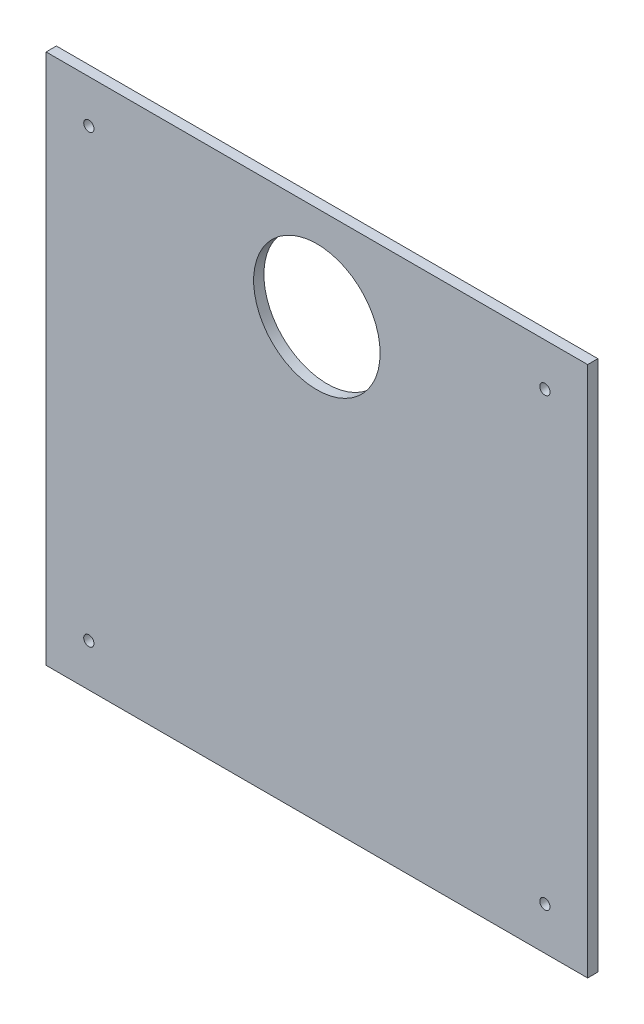
ISO-10303-21;
HEADER;
FILE_DESCRIPTION(('STEP AP214'),'2;1');
FILE_NAME('part.step','',(''),(''),'','','');
FILE_SCHEMA(('AUTOMOTIVE_DESIGN { 1 0 10303 214 1 1 1 1 }'));
ENDSEC;
DATA;
#1=APPLICATION_CONTEXT('core data for automotive mechanical design processes');
#2=APPLICATION_PROTOCOL_DEFINITION('international standard','automotive_design',2000,#1);
#3=PRODUCT_CONTEXT('',#1,'mechanical');
#4=PRODUCT('Part','Part','',(#3));
#5=PRODUCT_RELATED_PRODUCT_CATEGORY('part','',(#4));
#6=PRODUCT_DEFINITION_FORMATION('','',#4);
#7=PRODUCT_DEFINITION_CONTEXT('part definition',#1,'design');
#8=PRODUCT_DEFINITION('design','',#6,#7);
#9=PRODUCT_DEFINITION_SHAPE('','',#8);
#10=(LENGTH_UNIT() NAMED_UNIT(*) SI_UNIT(.MILLI.,.METRE.));
#11=(NAMED_UNIT(*) PLANE_ANGLE_UNIT() SI_UNIT($,.RADIAN.));
#12=(NAMED_UNIT(*) SI_UNIT($,.STERADIAN.) SOLID_ANGLE_UNIT());
#13=UNCERTAINTY_MEASURE_WITH_UNIT(LENGTH_MEASURE(1.E-05),#10,'distance_accuracy_value','');
#14=(GEOMETRIC_REPRESENTATION_CONTEXT(3) GLOBAL_UNCERTAINTY_ASSIGNED_CONTEXT((#13)) GLOBAL_UNIT_ASSIGNED_CONTEXT((#10,
#11,#12)) REPRESENTATION_CONTEXT('',''));
#15=CARTESIAN_POINT('',(0.,0.,0.));
#16=DIRECTION('',(0.,0.,1.));
#17=DIRECTION('',(1.,0.,0.));
#18=AXIS2_PLACEMENT_3D('',#15,#16,#17);
#19=CARTESIAN_POINT('',(-158.4,-228.6,6.));
#20=DIRECTION('',(1.,0.,0.));
#21=DIRECTION('',(0.,0.,-1.));
#22=AXIS2_PLACEMENT_3D('',#19,#20,#21);
#23=PLANE('',#22);
#24=DIRECTION('',(0.,-1.,0.));
#25=VECTOR('',#24,1.);
#26=CARTESIAN_POINT('',(-158.4,-228.6,0.));
#27=LINE('',#26,#25);
#28=CARTESIAN_POINT('',(-158.4,228.6,0.));
#29=VERTEX_POINT('',#28);
#30=CARTESIAN_POINT('',(-158.4,-82.2,0.));
#31=VERTEX_POINT('',#30);
#32=EDGE_CURVE('E81',#29,#31,#27,.T.);
#33=ORIENTED_EDGE('',*,*,#32,.T.);
#34=DIRECTION('',(0.,0.,1.));
#35=VECTOR('',#34,1.);
#36=CARTESIAN_POINT('',(-158.4,-82.2,0.));
#37=LINE('',#36,#35);
#38=CARTESIAN_POINT('',(-158.4,-82.2,6.));
#39=VERTEX_POINT('',#38);
#40=EDGE_CURVE('E47',#31,#39,#37,.T.);
#41=ORIENTED_EDGE('',*,*,#40,.T.);
#42=DIRECTION('',(0.,-1.,0.));
#43=VECTOR('',#42,1.);
#44=CARTESIAN_POINT('',(-158.4,-228.6,6.));
#45=LINE('',#44,#43);
#46=CARTESIAN_POINT('',(-158.4,228.6,6.));
#47=VERTEX_POINT('',#46);
#48=EDGE_CURVE('E76',#47,#39,#45,.T.);
#49=ORIENTED_EDGE('',*,*,#48,.F.);
#50=DIRECTION('',(0.,0.,-1.));
#51=VECTOR('',#50,1.);
#52=CARTESIAN_POINT('',(-158.4,228.6,6.));
#53=LINE('',#52,#51);
#54=EDGE_CURVE('E40',#47,#29,#53,.T.);
#55=ORIENTED_EDGE('',*,*,#54,.T.);
#56=EDGE_LOOP('',(#33,#41,#49,#55));
#57=FACE_BOUND('',#56,.T.);
#58=ADVANCED_FACE('F33',(#57),#23,.F.);
#59=CARTESIAN_POINT('',(158.4,-228.6,6.));
#60=DIRECTION('',(-1.,0.,0.));
#61=DIRECTION('',(0.,0.,1.));
#62=AXIS2_PLACEMENT_3D('',#59,#60,#61);
#63=PLANE('',#62);
#64=DIRECTION('',(0.,1.,0.));
#65=VECTOR('',#64,1.);
#66=CARTESIAN_POINT('',(158.4,-228.6,6.));
#67=LINE('',#66,#65);
#68=CARTESIAN_POINT('',(158.4,-82.2,6.));
#69=VERTEX_POINT('',#68);
#70=CARTESIAN_POINT('',(158.4,228.6,6.));
#71=VERTEX_POINT('',#70);
#72=EDGE_CURVE('E92',#69,#71,#67,.T.);
#73=ORIENTED_EDGE('',*,*,#72,.F.);
#74=DIRECTION('',(0.,0.,1.));
#75=VECTOR('',#74,1.);
#76=CARTESIAN_POINT('',(158.4,-82.2,0.));
#77=LINE('',#76,#75);
#78=CARTESIAN_POINT('',(158.4,-82.2,0.));
#79=VERTEX_POINT('',#78);
#80=EDGE_CURVE('E97',#79,#69,#77,.T.);
#81=ORIENTED_EDGE('',*,*,#80,.F.);
#82=DIRECTION('',(0.,1.,0.));
#83=VECTOR('',#82,1.);
#84=CARTESIAN_POINT('',(158.4,-228.6,0.));
#85=LINE('',#84,#83);
#86=CARTESIAN_POINT('',(158.4,228.6,0.));
#87=VERTEX_POINT('',#86);
#88=EDGE_CURVE('E77',#79,#87,#85,.T.);
#89=ORIENTED_EDGE('',*,*,#88,.T.);
#90=DIRECTION('',(0.,0.,-1.));
#91=VECTOR('',#90,1.);
#92=CARTESIAN_POINT('',(158.4,228.6,6.));
#93=LINE('',#92,#91);
#94=EDGE_CURVE('E11',#71,#87,#93,.T.);
#95=ORIENTED_EDGE('',*,*,#94,.F.);
#96=EDGE_LOOP('',(#73,#81,#89,#95));
#97=FACE_BOUND('',#96,.T.);
#98=ADVANCED_FACE('F168',(#97),#63,.F.);
#99=CARTESIAN_POINT('',(158.4,228.6,6.));
#100=DIRECTION('',(0.,-1.,0.));
#101=DIRECTION('',(1.,0.,0.));
#102=AXIS2_PLACEMENT_3D('',#99,#100,#101);
#103=PLANE('',#102);
#104=DIRECTION('',(-1.,0.,0.));
#105=VECTOR('',#104,1.);
#106=CARTESIAN_POINT('',(158.4,228.6,0.));
#107=LINE('',#106,#105);
#108=EDGE_CURVE('E68',#87,#29,#107,.T.);
#109=ORIENTED_EDGE('',*,*,#108,.T.);
#110=ORIENTED_EDGE('',*,*,#54,.F.);
#111=DIRECTION('',(-1.,0.,0.));
#112=VECTOR('',#111,1.);
#113=CARTESIAN_POINT('',(158.4,228.6,6.));
#114=LINE('',#113,#112);
#115=EDGE_CURVE('E56',#71,#47,#114,.T.);
#116=ORIENTED_EDGE('',*,*,#115,.F.);
#117=ORIENTED_EDGE('',*,*,#94,.T.);
#118=EDGE_LOOP('',(#109,#110,#116,#117));
#119=FACE_BOUND('',#118,.T.);
#120=ADVANCED_FACE('F70',(#119),#103,.F.);
#121=CARTESIAN_POINT('',(0.,0.,6.));
#122=DIRECTION('',(0.,0.,1.));
#123=DIRECTION('',(1.,0.,0.));
#124=AXIS2_PLACEMENT_3D('',#121,#122,#123);
#125=PLANE('',#124);
#126=CARTESIAN_POINT('',(-133.4,-57.2,6.));
#127=DIRECTION('',(0.,0.,1.));
#128=DIRECTION('',(1.,0.,0.));
#129=AXIS2_PLACEMENT_3D('',#126,#127,#128);
#130=CIRCLE('',#129,2.99999999999999);
#131=CARTESIAN_POINT('',(-130.4,-57.2,6.));
#132=VERTEX_POINT('',#131);
#133=EDGE_CURVE('E123',#132,#132,#130,.T.);
#134=ORIENTED_EDGE('',*,*,#133,.F.);
#135=EDGE_LOOP('',(#134));
#136=FACE_BOUND('',#135,.T.);
#137=CARTESIAN_POINT('',(133.4,-57.2,6.));
#138=DIRECTION('',(0.,0.,1.));
#139=DIRECTION('',(1.,0.,0.));
#140=AXIS2_PLACEMENT_3D('',#137,#138,#139);
#141=CIRCLE('',#140,2.99999999999999);
#142=CARTESIAN_POINT('',(136.4,-57.2,6.));
#143=VERTEX_POINT('',#142);
#144=EDGE_CURVE('E117',#143,#143,#141,.T.);
#145=ORIENTED_EDGE('',*,*,#144,.F.);
#146=EDGE_LOOP('',(#145));
#147=FACE_BOUND('',#146,.T.);
#148=CARTESIAN_POINT('',(133.4,203.6,6.));
#149=DIRECTION('',(0.,0.,1.));
#150=DIRECTION('',(1.,0.,0.));
#151=AXIS2_PLACEMENT_3D('',#148,#149,#150);
#152=CIRCLE('',#151,2.99999999999999);
#153=CARTESIAN_POINT('',(136.4,203.6,6.));
#154=VERTEX_POINT('',#153);
#155=EDGE_CURVE('E111',#154,#154,#152,.T.);
#156=ORIENTED_EDGE('',*,*,#155,.F.);
#157=EDGE_LOOP('',(#156));
#158=FACE_BOUND('',#157,.T.);
#159=CARTESIAN_POINT('',(-133.4,203.6,6.));
#160=DIRECTION('',(0.,0.,1.));
#161=DIRECTION('',(1.,0.,0.));
#162=AXIS2_PLACEMENT_3D('',#159,#160,#161);
#163=CIRCLE('',#162,2.99999999999999);
#164=CARTESIAN_POINT('',(-130.4,203.6,6.));
#165=VERTEX_POINT('',#164);
#166=EDGE_CURVE('E105',#165,#165,#163,.T.);
#167=ORIENTED_EDGE('',*,*,#166,.F.);
#168=EDGE_LOOP('',(#167));
#169=FACE_BOUND('',#168,.T.);
#170=DIRECTION('',(-1.,0.,0.));
#171=VECTOR('',#170,1.);
#172=CARTESIAN_POINT('',(-158.4,-82.2,6.));
#173=LINE('',#172,#171);
#174=EDGE_CURVE('E101',#69,#39,#173,.T.);
#175=ORIENTED_EDGE('',*,*,#174,.F.);
#176=ORIENTED_EDGE('',*,*,#72,.T.);
#177=ORIENTED_EDGE('',*,*,#115,.T.);
#178=ORIENTED_EDGE('',*,*,#48,.T.);
#179=EDGE_LOOP('',(#175,#176,#177,#178));
#180=FACE_BOUND('',#179,.T.);
#181=CARTESIAN_POINT('',(0.,173.6,6.));
#182=DIRECTION('',(0.,0.,1.));
#183=DIRECTION('',(1.,0.,0.));
#184=AXIS2_PLACEMENT_3D('',#181,#182,#183);
#185=CIRCLE('',#184,37.);
#186=CARTESIAN_POINT('',(36.9999999999999,173.6,6.));
#187=VERTEX_POINT('',#186);
#188=EDGE_CURVE('E88',#187,#187,#185,.T.);
#189=ORIENTED_EDGE('',*,*,#188,.F.);
#190=EDGE_LOOP('',(#189));
#191=FACE_BOUND('',#190,.T.);
#192=ADVANCED_FACE('F138',(#136,#147,#158,#169,#180,#191),#125,.T.);
#193=CARTESIAN_POINT('',(0.,0.,0.));
#194=DIRECTION('',(0.,0.,1.));
#195=DIRECTION('',(1.,0.,0.));
#196=AXIS2_PLACEMENT_3D('',#193,#194,#195);
#197=PLANE('',#196);
#198=CARTESIAN_POINT('',(-133.4,-57.2,0.));
#199=DIRECTION('',(0.,0.,1.));
#200=DIRECTION('',(1.,0.,0.));
#201=AXIS2_PLACEMENT_3D('',#198,#199,#200);
#202=CIRCLE('',#201,2.99999999999999);
#203=CARTESIAN_POINT('',(-130.4,-57.2,0.));
#204=VERTEX_POINT('',#203);
#205=EDGE_CURVE('E108',#204,#204,#202,.T.);
#206=ORIENTED_EDGE('',*,*,#205,.T.);
#207=EDGE_LOOP('',(#206));
#208=FACE_BOUND('',#207,.T.);
#209=CARTESIAN_POINT('',(133.4,-57.2,0.));
#210=DIRECTION('',(0.,0.,1.));
#211=DIRECTION('',(1.,0.,0.));
#212=AXIS2_PLACEMENT_3D('',#209,#210,#211);
#213=CIRCLE('',#212,2.99999999999999);
#214=CARTESIAN_POINT('',(136.4,-57.2,0.));
#215=VERTEX_POINT('',#214);
#216=EDGE_CURVE('E120',#215,#215,#213,.T.);
#217=ORIENTED_EDGE('',*,*,#216,.T.);
#218=EDGE_LOOP('',(#217));
#219=FACE_BOUND('',#218,.T.);
#220=CARTESIAN_POINT('',(133.4,203.6,0.));
#221=DIRECTION('',(0.,0.,1.));
#222=DIRECTION('',(1.,0.,0.));
#223=AXIS2_PLACEMENT_3D('',#220,#221,#222);
#224=CIRCLE('',#223,2.99999999999999);
#225=CARTESIAN_POINT('',(136.4,203.6,0.));
#226=VERTEX_POINT('',#225);
#227=EDGE_CURVE('E114',#226,#226,#224,.T.);
#228=ORIENTED_EDGE('',*,*,#227,.T.);
#229=EDGE_LOOP('',(#228));
#230=FACE_BOUND('',#229,.T.);
#231=CARTESIAN_POINT('',(-133.4,203.6,0.));
#232=DIRECTION('',(0.,0.,1.));
#233=DIRECTION('',(1.,0.,0.));
#234=AXIS2_PLACEMENT_3D('',#231,#232,#233);
#235=CIRCLE('',#234,2.99999999999999);
#236=CARTESIAN_POINT('',(-130.4,203.6,0.));
#237=VERTEX_POINT('',#236);
#238=EDGE_CURVE('E103',#237,#237,#235,.T.);
#239=ORIENTED_EDGE('',*,*,#238,.T.);
#240=EDGE_LOOP('',(#239));
#241=FACE_BOUND('',#240,.T.);
#242=CARTESIAN_POINT('',(0.,173.6,0.));
#243=DIRECTION('',(0.,0.,1.));
#244=DIRECTION('',(1.,0.,0.));
#245=AXIS2_PLACEMENT_3D('',#242,#243,#244);
#246=CIRCLE('',#245,37.);
#247=CARTESIAN_POINT('',(36.9999999999999,173.6,0.));
#248=VERTEX_POINT('',#247);
#249=EDGE_CURVE('E84',#248,#248,#246,.T.);
#250=ORIENTED_EDGE('',*,*,#249,.T.);
#251=EDGE_LOOP('',(#250));
#252=FACE_BOUND('',#251,.T.);
#253=ORIENTED_EDGE('',*,*,#88,.F.);
#254=DIRECTION('',(-1.,0.,0.));
#255=VECTOR('',#254,1.);
#256=CARTESIAN_POINT('',(-158.4,-82.2,0.));
#257=LINE('',#256,#255);
#258=EDGE_CURVE('E83',#79,#31,#257,.T.);
#259=ORIENTED_EDGE('',*,*,#258,.T.);
#260=ORIENTED_EDGE('',*,*,#32,.F.);
#261=ORIENTED_EDGE('',*,*,#108,.F.);
#262=EDGE_LOOP('',(#253,#259,#260,#261));
#263=FACE_BOUND('',#262,.T.);
#264=ADVANCED_FACE('F82',(#208,#219,#230,#241,#252,#263),#197,.F.);
#265=CARTESIAN_POINT('',(0.,173.6,0.));
#266=DIRECTION('',(0.,0.,1.));
#267=DIRECTION('',(1.,0.,0.));
#268=AXIS2_PLACEMENT_3D('',#265,#266,#267);
#269=CYLINDRICAL_SURFACE('',#268,37.);
#270=ORIENTED_EDGE('',*,*,#249,.F.);
#271=EDGE_LOOP('',(#270));
#272=FACE_BOUND('',#271,.T.);
#273=ORIENTED_EDGE('',*,*,#188,.T.);
#274=EDGE_LOOP('',(#273));
#275=FACE_BOUND('',#274,.T.);
#276=ADVANCED_FACE('F153',(#272,#275),#269,.F.);
#277=CARTESIAN_POINT('',(-158.4,-82.2,0.));
#278=DIRECTION('',(0.,1.,0.));
#279=DIRECTION('',(0.,0.,1.));
#280=AXIS2_PLACEMENT_3D('',#277,#278,#279);
#281=PLANE('',#280);
#282=ORIENTED_EDGE('',*,*,#174,.T.);
#283=ORIENTED_EDGE('',*,*,#40,.F.);
#284=ORIENTED_EDGE('',*,*,#258,.F.);
#285=ORIENTED_EDGE('',*,*,#80,.T.);
#286=EDGE_LOOP('',(#282,#283,#284,#285));
#287=FACE_BOUND('',#286,.T.);
#288=ADVANCED_FACE('F155',(#287),#281,.F.);
#289=CARTESIAN_POINT('',(-133.4,203.6,0.));
#290=DIRECTION('',(0.,0.,1.));
#291=DIRECTION('',(1.,0.,0.));
#292=AXIS2_PLACEMENT_3D('',#289,#290,#291);
#293=CYLINDRICAL_SURFACE('',#292,2.99999999999999);
#294=ORIENTED_EDGE('',*,*,#238,.F.);
#295=EDGE_LOOP('',(#294));
#296=FACE_BOUND('',#295,.T.);
#297=ORIENTED_EDGE('',*,*,#166,.T.);
#298=EDGE_LOOP('',(#297));
#299=FACE_BOUND('',#298,.T.);
#300=ADVANCED_FACE('F162',(#296,#299),#293,.F.);
#301=CARTESIAN_POINT('',(133.4,203.6,0.));
#302=DIRECTION('',(0.,0.,1.));
#303=DIRECTION('',(1.,0.,0.));
#304=AXIS2_PLACEMENT_3D('',#301,#302,#303);
#305=CYLINDRICAL_SURFACE('',#304,2.99999999999999);
#306=ORIENTED_EDGE('',*,*,#227,.F.);
#307=EDGE_LOOP('',(#306));
#308=FACE_BOUND('',#307,.T.);
#309=ORIENTED_EDGE('',*,*,#155,.T.);
#310=EDGE_LOOP('',(#309));
#311=FACE_BOUND('',#310,.T.);
#312=ADVANCED_FACE('F203',(#308,#311),#305,.F.);
#313=CARTESIAN_POINT('',(133.4,-57.2,0.));
#314=DIRECTION('',(0.,0.,1.));
#315=DIRECTION('',(1.,0.,0.));
#316=AXIS2_PLACEMENT_3D('',#313,#314,#315);
#317=CYLINDRICAL_SURFACE('',#316,2.99999999999999);
#318=ORIENTED_EDGE('',*,*,#216,.F.);
#319=EDGE_LOOP('',(#318));
#320=FACE_BOUND('',#319,.T.);
#321=ORIENTED_EDGE('',*,*,#144,.T.);
#322=EDGE_LOOP('',(#321));
#323=FACE_BOUND('',#322,.T.);
#324=ADVANCED_FACE('F134',(#320,#323),#317,.F.);
#325=CARTESIAN_POINT('',(-133.4,-57.2,0.));
#326=DIRECTION('',(0.,0.,1.));
#327=DIRECTION('',(1.,0.,0.));
#328=AXIS2_PLACEMENT_3D('',#325,#326,#327);
#329=CYLINDRICAL_SURFACE('',#328,2.99999999999999);
#330=ORIENTED_EDGE('',*,*,#205,.F.);
#331=EDGE_LOOP('',(#330));
#332=FACE_BOUND('',#331,.T.);
#333=ORIENTED_EDGE('',*,*,#133,.T.);
#334=EDGE_LOOP('',(#333));
#335=FACE_BOUND('',#334,.T.);
#336=ADVANCED_FACE('F131',(#332,#335),#329,.F.);
#337=CLOSED_SHELL('',(#58,#98,#120,#192,#264,#276,#288,#300,#312,#324,#336));
#338=MANIFOLD_SOLID_BREP('B2',#337);
#339=ADVANCED_BREP_SHAPE_REPRESENTATION('',(#18,#338),#14);
#340=SHAPE_DEFINITION_REPRESENTATION(#9,#339);
ENDSEC;
END-ISO-10303-21;
